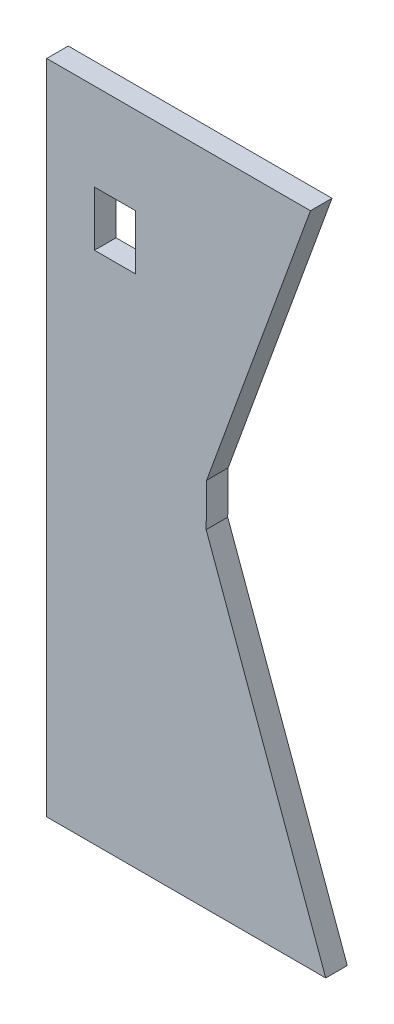
ISO-10303-21;
HEADER;
FILE_DESCRIPTION(('STEP AP214'),'2;1');
FILE_NAME('part.step','',(''),(''),'','','');
FILE_SCHEMA(('AUTOMOTIVE_DESIGN { 1 0 10303 214 1 1 1 1 }'));
ENDSEC;
DATA;
#1=APPLICATION_CONTEXT('core data for automotive mechanical design processes');
#2=APPLICATION_PROTOCOL_DEFINITION('international standard','automotive_design',2000,#1);
#3=PRODUCT_CONTEXT('',#1,'mechanical');
#4=PRODUCT('Part','Part','',(#3));
#5=PRODUCT_RELATED_PRODUCT_CATEGORY('part','',(#4));
#6=PRODUCT_DEFINITION_FORMATION('','',#4);
#7=PRODUCT_DEFINITION_CONTEXT('part definition',#1,'design');
#8=PRODUCT_DEFINITION('design','',#6,#7);
#9=PRODUCT_DEFINITION_SHAPE('','',#8);
#10=(LENGTH_UNIT() NAMED_UNIT(*) SI_UNIT(.MILLI.,.METRE.));
#11=(NAMED_UNIT(*) PLANE_ANGLE_UNIT() SI_UNIT($,.RADIAN.));
#12=(NAMED_UNIT(*) SI_UNIT($,.STERADIAN.) SOLID_ANGLE_UNIT());
#13=UNCERTAINTY_MEASURE_WITH_UNIT(LENGTH_MEASURE(1.E-05),#10,'distance_accuracy_value','');
#14=(GEOMETRIC_REPRESENTATION_CONTEXT(3) GLOBAL_UNCERTAINTY_ASSIGNED_CONTEXT((#13)) GLOBAL_UNIT_ASSIGNED_CONTEXT((#10,
#11,#12)) REPRESENTATION_CONTEXT('',''));
#15=CARTESIAN_POINT('',(0.,0.,0.));
#16=DIRECTION('',(0.,0.,1.));
#17=DIRECTION('',(1.,0.,0.));
#18=AXIS2_PLACEMENT_3D('',#15,#16,#17);
#19=CARTESIAN_POINT('',(0.,0.,10.));
#20=DIRECTION('',(0.,0.,1.));
#21=DIRECTION('',(1.,0.,0.));
#22=AXIS2_PLACEMENT_3D('',#19,#20,#21);
#23=PLANE('',#22);
#24=DIRECTION('',(1.,0.,0.));
#25=VECTOR('',#24,1.);
#26=CARTESIAN_POINT('',(-64.7407200778868,-152.4,10.));
#27=LINE('',#26,#25);
#28=CARTESIAN_POINT('',(-64.7407200778868,-152.4,10.));
#29=VERTEX_POINT('',#28);
#30=CARTESIAN_POINT('',(64.7407200778867,-152.4,10.));
#31=VERTEX_POINT('',#30);
#32=EDGE_CURVE('E154',#29,#31,#27,.T.);
#33=ORIENTED_EDGE('',*,*,#32,.T.);
#34=DIRECTION('',(-0.342020143325664,0.93969262078591,0.));
#35=VECTOR('',#34,1.);
#36=CARTESIAN_POINT('',(9.25725287334311,0.0395732975366769,10.));
#37=LINE('',#36,#35);
#38=CARTESIAN_POINT('',(9.25725287334311,0.0395732975366769,10.));
#39=VERTEX_POINT('',#38);
#40=EDGE_CURVE('E157',#31,#39,#37,.T.);
#41=ORIENTED_EDGE('',*,*,#40,.T.);
#42=DIRECTION('',(0.0100655840857754,0.999949340725325,0.));
#43=VECTOR('',#42,1.);
#44=CARTESIAN_POINT('',(9.25725287334311,0.0395732975366769,10.));
#45=LINE('',#44,#43);
#46=CARTESIAN_POINT('',(9.45810139937431,19.9925486518799,10.));
#47=VERTEX_POINT('',#46);
#48=EDGE_CURVE('E160',#39,#47,#45,.T.);
#49=ORIENTED_EDGE('',*,*,#48,.T.);
#50=DIRECTION('',(0.342020143325664,0.93969262078591,0.));
#51=VECTOR('',#50,1.);
#52=CARTESIAN_POINT('',(9.45810139937431,19.9925486518799,10.));
#53=LINE('',#52,#51);
#54=CARTESIAN_POINT('',(57.6504724851398,152.400000000001,10.));
#55=VERTEX_POINT('',#54);
#56=EDGE_CURVE('E162',#47,#55,#53,.T.);
#57=ORIENTED_EDGE('',*,*,#56,.T.);
#58=DIRECTION('',(-1.,0.,0.));
#59=VECTOR('',#58,1.);
#60=CARTESIAN_POINT('',(-64.7407200778862,152.4,10.));
#61=LINE('',#60,#59);
#62=CARTESIAN_POINT('',(-64.7407200778862,152.4,10.));
#63=VERTEX_POINT('',#62);
#64=EDGE_CURVE('E164',#55,#63,#61,.T.);
#65=ORIENTED_EDGE('',*,*,#64,.T.);
#66=DIRECTION('',(0.,-1.,0.));
#67=VECTOR('',#66,1.);
#68=CARTESIAN_POINT('',(-64.7407200778868,-152.4,10.));
#69=LINE('',#68,#67);
#70=EDGE_CURVE('E166',#63,#29,#69,.T.);
#71=ORIENTED_EDGE('',*,*,#70,.T.);
#72=EDGE_LOOP('',(#33,#41,#49,#57,#65,#71));
#73=FACE_BOUND('',#72,.T.);
#74=DIRECTION('',(0.,1.,0.));
#75=VECTOR('',#74,1.);
#76=CARTESIAN_POINT('',(-23.5104509009264,86.407046087355,10.));
#77=LINE('',#76,#75);
#78=CARTESIAN_POINT('',(-23.5104509009264,86.407046087355,10.));
#79=VERTEX_POINT('',#78);
#80=CARTESIAN_POINT('',(-23.5104509009264,111.807046087355,10.));
#81=VERTEX_POINT('',#80);
#82=EDGE_CURVE('E126',#79,#81,#77,.T.);
#83=ORIENTED_EDGE('',*,*,#82,.F.);
#84=DIRECTION('',(1.,0.,0.));
#85=VECTOR('',#84,1.);
#86=CARTESIAN_POINT('',(-42.5604509009264,86.407046087355,10.));
#87=LINE('',#86,#85);
#88=CARTESIAN_POINT('',(-42.5604509009264,86.407046087355,10.));
#89=VERTEX_POINT('',#88);
#90=EDGE_CURVE('E118',#89,#79,#87,.T.);
#91=ORIENTED_EDGE('',*,*,#90,.F.);
#92=DIRECTION('',(0.,-1.,0.));
#93=VECTOR('',#92,1.);
#94=CARTESIAN_POINT('',(-42.5604509009264,86.407046087355,10.));
#95=LINE('',#94,#93);
#96=CARTESIAN_POINT('',(-42.5604509009264,111.807046087355,10.));
#97=VERTEX_POINT('',#96);
#98=EDGE_CURVE('E140',#97,#89,#95,.T.);
#99=ORIENTED_EDGE('',*,*,#98,.F.);
#100=DIRECTION('',(-1.,0.,0.));
#101=VECTOR('',#100,1.);
#102=CARTESIAN_POINT('',(-42.5604509009264,111.807046087355,10.));
#103=LINE('',#102,#101);
#104=EDGE_CURVE('E138',#81,#97,#103,.T.);
#105=ORIENTED_EDGE('',*,*,#104,.F.);
#106=EDGE_LOOP('',(#83,#91,#99,#105));
#107=FACE_BOUND('',#106,.T.);
#108=ADVANCED_FACE('F41',(#73,#107),#23,.T.);
#109=CARTESIAN_POINT('',(0.,0.,0.));
#110=DIRECTION('',(0.,0.,1.));
#111=DIRECTION('',(1.,0.,0.));
#112=AXIS2_PLACEMENT_3D('',#109,#110,#111);
#113=PLANE('',#112);
#114=DIRECTION('',(1.,0.,0.));
#115=VECTOR('',#114,1.);
#116=CARTESIAN_POINT('',(-64.7407200778868,-152.4,0.));
#117=LINE('',#116,#115);
#118=CARTESIAN_POINT('',(-64.7407200778868,-152.4,0.));
#119=VERTEX_POINT('',#118);
#120=CARTESIAN_POINT('',(64.7407200778867,-152.4,0.));
#121=VERTEX_POINT('',#120);
#122=EDGE_CURVE('E134',#119,#121,#117,.T.);
#123=ORIENTED_EDGE('',*,*,#122,.F.);
#124=DIRECTION('',(0.,-1.,0.));
#125=VECTOR('',#124,1.);
#126=CARTESIAN_POINT('',(-64.7407200778868,-152.4,0.));
#127=LINE('',#126,#125);
#128=CARTESIAN_POINT('',(-64.7407200778862,152.4,0.));
#129=VERTEX_POINT('',#128);
#130=EDGE_CURVE('E158',#129,#119,#127,.T.);
#131=ORIENTED_EDGE('',*,*,#130,.F.);
#132=DIRECTION('',(-1.,0.,0.));
#133=VECTOR('',#132,1.);
#134=CARTESIAN_POINT('',(-64.7407200778862,152.4,0.));
#135=LINE('',#134,#133);
#136=CARTESIAN_POINT('',(57.6504724851398,152.400000000001,0.));
#137=VERTEX_POINT('',#136);
#138=EDGE_CURVE('E177',#137,#129,#135,.T.);
#139=ORIENTED_EDGE('',*,*,#138,.F.);
#140=DIRECTION('',(0.342020143325664,0.93969262078591,0.));
#141=VECTOR('',#140,1.);
#142=CARTESIAN_POINT('',(9.45810139937431,19.9925486518799,0.));
#143=LINE('',#142,#141);
#144=CARTESIAN_POINT('',(9.45810139937431,19.9925486518799,0.));
#145=VERTEX_POINT('',#144);
#146=EDGE_CURVE('E175',#145,#137,#143,.T.);
#147=ORIENTED_EDGE('',*,*,#146,.F.);
#148=DIRECTION('',(0.0100655840857754,0.999949340725325,0.));
#149=VECTOR('',#148,1.);
#150=CARTESIAN_POINT('',(9.25725287334311,0.0395732975366769,0.));
#151=LINE('',#150,#149);
#152=CARTESIAN_POINT('',(9.25725287334311,0.0395732975366769,0.));
#153=VERTEX_POINT('',#152);
#154=EDGE_CURVE('E173',#153,#145,#151,.T.);
#155=ORIENTED_EDGE('',*,*,#154,.F.);
#156=DIRECTION('',(-0.342020143325664,0.93969262078591,0.));
#157=VECTOR('',#156,1.);
#158=CARTESIAN_POINT('',(9.25725287334311,0.0395732975366769,0.));
#159=LINE('',#158,#157);
#160=EDGE_CURVE('E171',#121,#153,#159,.T.);
#161=ORIENTED_EDGE('',*,*,#160,.F.);
#162=EDGE_LOOP('',(#123,#131,#139,#147,#155,#161));
#163=FACE_BOUND('',#162,.T.);
#164=DIRECTION('',(1.,0.,0.));
#165=VECTOR('',#164,1.);
#166=CARTESIAN_POINT('',(-42.5604509009264,86.407046087355,0.));
#167=LINE('',#166,#165);
#168=CARTESIAN_POINT('',(-42.5604509009264,86.407046087355,0.));
#169=VERTEX_POINT('',#168);
#170=CARTESIAN_POINT('',(-23.5104509009264,86.407046087355,0.));
#171=VERTEX_POINT('',#170);
#172=EDGE_CURVE('E64',#169,#171,#167,.T.);
#173=ORIENTED_EDGE('',*,*,#172,.T.);
#174=DIRECTION('',(0.,1.,0.));
#175=VECTOR('',#174,1.);
#176=CARTESIAN_POINT('',(-23.5104509009264,86.407046087355,0.));
#177=LINE('',#176,#175);
#178=CARTESIAN_POINT('',(-23.5104509009264,111.807046087355,0.));
#179=VERTEX_POINT('',#178);
#180=EDGE_CURVE('E133',#171,#179,#177,.T.);
#181=ORIENTED_EDGE('',*,*,#180,.T.);
#182=DIRECTION('',(-1.,0.,0.));
#183=VECTOR('',#182,1.);
#184=CARTESIAN_POINT('',(-42.5604509009264,111.807046087355,0.));
#185=LINE('',#184,#183);
#186=CARTESIAN_POINT('',(-42.5604509009264,111.807046087355,0.));
#187=VERTEX_POINT('',#186);
#188=EDGE_CURVE('E146',#179,#187,#185,.T.);
#189=ORIENTED_EDGE('',*,*,#188,.T.);
#190=DIRECTION('',(0.,-1.,0.));
#191=VECTOR('',#190,1.);
#192=CARTESIAN_POINT('',(-42.5604509009264,86.407046087355,0.));
#193=LINE('',#192,#191);
#194=EDGE_CURVE('E127',#187,#169,#193,.T.);
#195=ORIENTED_EDGE('',*,*,#194,.T.);
#196=EDGE_LOOP('',(#173,#181,#189,#195));
#197=FACE_BOUND('',#196,.T.);
#198=ADVANCED_FACE('F201',(#163,#197),#113,.F.);
#199=CARTESIAN_POINT('',(-64.7407200778868,-152.4,10.));
#200=DIRECTION('',(0.,1.,0.));
#201=DIRECTION('',(-1.,0.,0.));
#202=AXIS2_PLACEMENT_3D('',#199,#200,#201);
#203=PLANE('',#202);
#204=ORIENTED_EDGE('',*,*,#122,.T.);
#205=DIRECTION('',(0.,0.,-1.));
#206=VECTOR('',#205,1.);
#207=CARTESIAN_POINT('',(64.7407200778867,-152.4,10.));
#208=LINE('',#207,#206);
#209=EDGE_CURVE('E11',#31,#121,#208,.T.);
#210=ORIENTED_EDGE('',*,*,#209,.F.);
#211=ORIENTED_EDGE('',*,*,#32,.F.);
#212=DIRECTION('',(0.,0.,-1.));
#213=VECTOR('',#212,1.);
#214=CARTESIAN_POINT('',(-64.7407200778868,-152.4,10.));
#215=LINE('',#214,#213);
#216=EDGE_CURVE('E168',#29,#119,#215,.T.);
#217=ORIENTED_EDGE('',*,*,#216,.T.);
#218=EDGE_LOOP('',(#204,#210,#211,#217));
#219=FACE_BOUND('',#218,.T.);
#220=ADVANCED_FACE('F43',(#219),#203,.F.);
#221=CARTESIAN_POINT('',(9.25725287334311,0.0395732975366769,10.));
#222=DIRECTION('',(-0.93969262078591,-0.342020143325664,0.));
#223=DIRECTION('',(0.342020143325664,-0.93969262078591,0.));
#224=AXIS2_PLACEMENT_3D('',#221,#222,#223);
#225=PLANE('',#224);
#226=ORIENTED_EDGE('',*,*,#160,.T.);
#227=DIRECTION('',(0.,0.,-1.));
#228=VECTOR('',#227,1.);
#229=CARTESIAN_POINT('',(9.25725287334311,0.0395732975366769,10.));
#230=LINE('',#229,#228);
#231=EDGE_CURVE('E49',#39,#153,#230,.T.);
#232=ORIENTED_EDGE('',*,*,#231,.F.);
#233=ORIENTED_EDGE('',*,*,#40,.F.);
#234=ORIENTED_EDGE('',*,*,#209,.T.);
#235=EDGE_LOOP('',(#226,#232,#233,#234));
#236=FACE_BOUND('',#235,.T.);
#237=ADVANCED_FACE('F218',(#236),#225,.F.);
#238=CARTESIAN_POINT('',(9.25725287334311,0.0395732975366769,10.));
#239=DIRECTION('',(-0.999949340725325,0.0100655840857754,0.));
#240=DIRECTION('',(-0.0100655840857754,-0.999949340725325,0.));
#241=AXIS2_PLACEMENT_3D('',#238,#239,#240);
#242=PLANE('',#241);
#243=ORIENTED_EDGE('',*,*,#154,.T.);
#244=DIRECTION('',(0.,0.,-1.));
#245=VECTOR('',#244,1.);
#246=CARTESIAN_POINT('',(9.45810139937431,19.9925486518799,10.));
#247=LINE('',#246,#245);
#248=EDGE_CURVE('E188',#47,#145,#247,.T.);
#249=ORIENTED_EDGE('',*,*,#248,.F.);
#250=ORIENTED_EDGE('',*,*,#48,.F.);
#251=ORIENTED_EDGE('',*,*,#231,.T.);
#252=EDGE_LOOP('',(#243,#249,#250,#251));
#253=FACE_BOUND('',#252,.T.);
#254=ADVANCED_FACE('F195',(#253),#242,.F.);
#255=CARTESIAN_POINT('',(9.45810139937431,19.9925486518799,10.));
#256=DIRECTION('',(-0.93969262078591,0.342020143325664,0.));
#257=DIRECTION('',(-0.342020143325664,-0.93969262078591,0.));
#258=AXIS2_PLACEMENT_3D('',#255,#256,#257);
#259=PLANE('',#258);
#260=ORIENTED_EDGE('',*,*,#146,.T.);
#261=DIRECTION('',(0.,0.,-1.));
#262=VECTOR('',#261,1.);
#263=CARTESIAN_POINT('',(57.6504724851398,152.400000000001,10.));
#264=LINE('',#263,#262);
#265=EDGE_CURVE('E185',#55,#137,#264,.T.);
#266=ORIENTED_EDGE('',*,*,#265,.F.);
#267=ORIENTED_EDGE('',*,*,#56,.F.);
#268=ORIENTED_EDGE('',*,*,#248,.T.);
#269=EDGE_LOOP('',(#260,#266,#267,#268));
#270=FACE_BOUND('',#269,.T.);
#271=ADVANCED_FACE('F207',(#270),#259,.F.);
#272=CARTESIAN_POINT('',(-64.7407200778862,152.4,10.));
#273=DIRECTION('',(0.,-1.,0.));
#274=DIRECTION('',(1.,0.,0.));
#275=AXIS2_PLACEMENT_3D('',#272,#273,#274);
#276=PLANE('',#275);
#277=ORIENTED_EDGE('',*,*,#138,.T.);
#278=DIRECTION('',(0.,0.,-1.));
#279=VECTOR('',#278,1.);
#280=CARTESIAN_POINT('',(-64.7407200778862,152.4,10.));
#281=LINE('',#280,#279);
#282=EDGE_CURVE('E182',#63,#129,#281,.T.);
#283=ORIENTED_EDGE('',*,*,#282,.F.);
#284=ORIENTED_EDGE('',*,*,#64,.F.);
#285=ORIENTED_EDGE('',*,*,#265,.T.);
#286=EDGE_LOOP('',(#277,#283,#284,#285));
#287=FACE_BOUND('',#286,.T.);
#288=ADVANCED_FACE('F211',(#287),#276,.F.);
#289=CARTESIAN_POINT('',(-64.7407200778868,-152.4,10.));
#290=DIRECTION('',(1.,0.,0.));
#291=DIRECTION('',(0.,1.,0.));
#292=AXIS2_PLACEMENT_3D('',#289,#290,#291);
#293=PLANE('',#292);
#294=ORIENTED_EDGE('',*,*,#130,.T.);
#295=ORIENTED_EDGE('',*,*,#216,.F.);
#296=ORIENTED_EDGE('',*,*,#70,.F.);
#297=ORIENTED_EDGE('',*,*,#282,.T.);
#298=EDGE_LOOP('',(#294,#295,#296,#297));
#299=FACE_BOUND('',#298,.T.);
#300=ADVANCED_FACE('F221',(#299),#293,.F.);
#301=CARTESIAN_POINT('',(-42.5604509009264,86.407046087355,10.));
#302=DIRECTION('',(0.,1.,0.));
#303=DIRECTION('',(0.,0.,1.));
#304=AXIS2_PLACEMENT_3D('',#301,#302,#303);
#305=PLANE('',#304);
#306=ORIENTED_EDGE('',*,*,#172,.F.);
#307=DIRECTION('',(0.,0.,-1.));
#308=VECTOR('',#307,1.);
#309=CARTESIAN_POINT('',(-42.5604509009264,86.407046087355,10.));
#310=LINE('',#309,#308);
#311=EDGE_CURVE('E122',#89,#169,#310,.T.);
#312=ORIENTED_EDGE('',*,*,#311,.F.);
#313=ORIENTED_EDGE('',*,*,#90,.T.);
#314=DIRECTION('',(0.,0.,-1.));
#315=VECTOR('',#314,1.);
#316=CARTESIAN_POINT('',(-23.5104509009264,86.407046087355,10.));
#317=LINE('',#316,#315);
#318=EDGE_CURVE('E121',#79,#171,#317,.T.);
#319=ORIENTED_EDGE('',*,*,#318,.T.);
#320=EDGE_LOOP('',(#306,#312,#313,#319));
#321=FACE_BOUND('',#320,.T.);
#322=ADVANCED_FACE('F120',(#321),#305,.T.);
#323=CARTESIAN_POINT('',(-23.5104509009264,86.407046087355,10.));
#324=DIRECTION('',(-1.,0.,0.));
#325=DIRECTION('',(0.,0.,1.));
#326=AXIS2_PLACEMENT_3D('',#323,#324,#325);
#327=PLANE('',#326);
#328=ORIENTED_EDGE('',*,*,#180,.F.);
#329=ORIENTED_EDGE('',*,*,#318,.F.);
#330=ORIENTED_EDGE('',*,*,#82,.T.);
#331=DIRECTION('',(0.,0.,-1.));
#332=VECTOR('',#331,1.);
#333=CARTESIAN_POINT('',(-23.5104509009264,111.807046087355,10.));
#334=LINE('',#333,#332);
#335=EDGE_CURVE('E135',#81,#179,#334,.T.);
#336=ORIENTED_EDGE('',*,*,#335,.T.);
#337=EDGE_LOOP('',(#328,#329,#330,#336));
#338=FACE_BOUND('',#337,.T.);
#339=ADVANCED_FACE('F130',(#338),#327,.T.);
#340=CARTESIAN_POINT('',(-42.5604509009264,111.807046087355,10.));
#341=DIRECTION('',(0.,-1.,0.));
#342=DIRECTION('',(0.,0.,-1.));
#343=AXIS2_PLACEMENT_3D('',#340,#341,#342);
#344=PLANE('',#343);
#345=ORIENTED_EDGE('',*,*,#188,.F.);
#346=ORIENTED_EDGE('',*,*,#335,.F.);
#347=ORIENTED_EDGE('',*,*,#104,.T.);
#348=DIRECTION('',(0.,0.,-1.));
#349=VECTOR('',#348,1.);
#350=CARTESIAN_POINT('',(-42.5604509009264,111.807046087355,10.));
#351=LINE('',#350,#349);
#352=EDGE_CURVE('E56',#97,#187,#351,.T.);
#353=ORIENTED_EDGE('',*,*,#352,.T.);
#354=EDGE_LOOP('',(#345,#346,#347,#353));
#355=FACE_BOUND('',#354,.T.);
#356=ADVANCED_FACE('F239',(#355),#344,.T.);
#357=CARTESIAN_POINT('',(-42.5604509009264,86.407046087355,10.));
#358=DIRECTION('',(1.,0.,0.));
#359=DIRECTION('',(0.,0.,-1.));
#360=AXIS2_PLACEMENT_3D('',#357,#358,#359);
#361=PLANE('',#360);
#362=ORIENTED_EDGE('',*,*,#194,.F.);
#363=ORIENTED_EDGE('',*,*,#352,.F.);
#364=ORIENTED_EDGE('',*,*,#98,.T.);
#365=ORIENTED_EDGE('',*,*,#311,.T.);
#366=EDGE_LOOP('',(#362,#363,#364,#365));
#367=FACE_BOUND('',#366,.T.);
#368=ADVANCED_FACE('F242',(#367),#361,.T.);
#369=CLOSED_SHELL('',(#108,#198,#220,#237,#254,#271,#288,#300,#322,#339,#356,#368));
#370=MANIFOLD_SOLID_BREP('B2',#369);
#371=ADVANCED_BREP_SHAPE_REPRESENTATION('',(#18,#370),#14);
#372=SHAPE_DEFINITION_REPRESENTATION(#9,#371);
ENDSEC;
END-ISO-10303-21;
